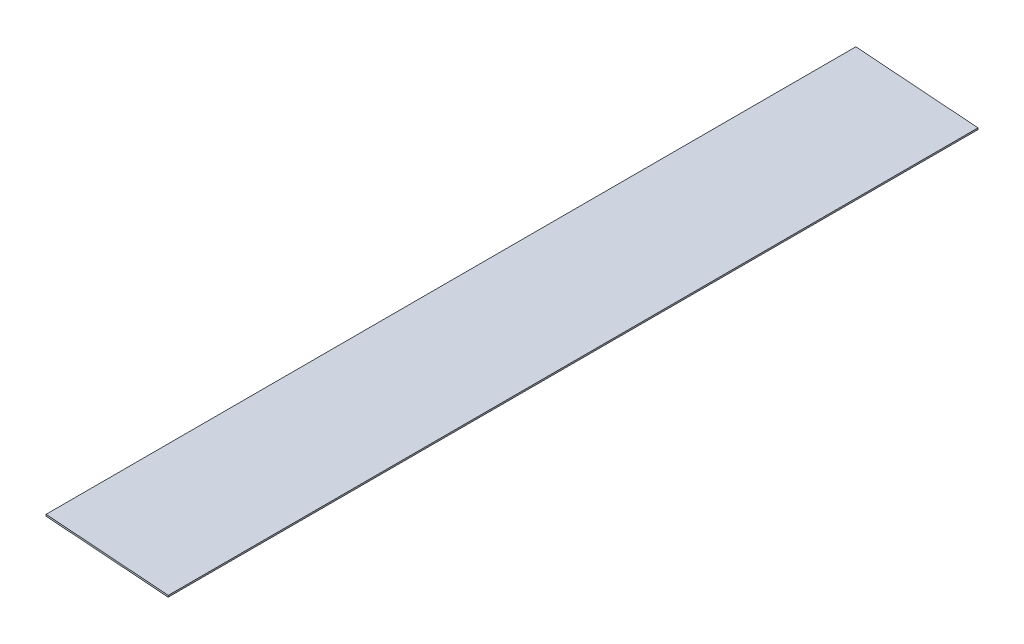
ISO-10303-21;
HEADER;
FILE_DESCRIPTION(('STEP AP214'),'2;1');
FILE_NAME('part.step','',(''),(''),'','','');
FILE_SCHEMA(('AUTOMOTIVE_DESIGN { 1 0 10303 214 1 1 1 1 }'));
ENDSEC;
DATA;
#1=APPLICATION_CONTEXT('core data for automotive mechanical design processes');
#2=APPLICATION_PROTOCOL_DEFINITION('international standard','automotive_design',2000,#1);
#3=PRODUCT_CONTEXT('',#1,'mechanical');
#4=PRODUCT('Part','Part','',(#3));
#5=PRODUCT_RELATED_PRODUCT_CATEGORY('part','',(#4));
#6=PRODUCT_DEFINITION_FORMATION('','',#4);
#7=PRODUCT_DEFINITION_CONTEXT('part definition',#1,'design');
#8=PRODUCT_DEFINITION('design','',#6,#7);
#9=PRODUCT_DEFINITION_SHAPE('','',#8);
#10=(LENGTH_UNIT() NAMED_UNIT(*) SI_UNIT(.MILLI.,.METRE.));
#11=(NAMED_UNIT(*) PLANE_ANGLE_UNIT() SI_UNIT($,.RADIAN.));
#12=(NAMED_UNIT(*) SI_UNIT($,.STERADIAN.) SOLID_ANGLE_UNIT());
#13=UNCERTAINTY_MEASURE_WITH_UNIT(LENGTH_MEASURE(1.E-05),#10,'distance_accuracy_value','');
#14=(GEOMETRIC_REPRESENTATION_CONTEXT(3) GLOBAL_UNCERTAINTY_ASSIGNED_CONTEXT((#13)) GLOBAL_UNIT_ASSIGNED_CONTEXT((#10,
#11,#12)) REPRESENTATION_CONTEXT('',''));
#15=CARTESIAN_POINT('',(0.,0.,0.));
#16=DIRECTION('',(0.,0.,1.));
#17=DIRECTION('',(1.,0.,0.));
#18=AXIS2_PLACEMENT_3D('',#15,#16,#17);
#19=CARTESIAN_POINT('',(-366.091882124065,-2.59705065904796,0.));
#20=DIRECTION('',(0.,0.,-1.));
#21=DIRECTION('',(-1.,0.,0.));
#22=AXIS2_PLACEMENT_3D('',#19,#20,#21);
#23=PLANE('',#22);
#24=CARTESIAN_POINT('',(-394.480856129213,-0.432132552611794,0.));
#25=CARTESIAN_POINT('',(-393.304411991829,-0.526414354543713,0.));
#26=CARTESIAN_POINT('',(-392.132616448483,-0.618641995903297,0.));
#27=CARTESIAN_POINT('',(-389.770621953477,-0.802160875998841,0.));
#28=CARTESIAN_POINT('',(-388.580331816745,-0.893452486845799,0.));
#29=CARTESIAN_POINT('',(-385.019451581036,-1.16673083505754,0.));
#30=CARTESIAN_POINT('',(-382.658705525776,-1.34823978305714,0.));
#31=CARTESIAN_POINT('',(-375.567770856613,-1.88921658464382,0.));
#32=CARTESIAN_POINT('',(-370.828482868122,-2.24501159097367,0.));
#33=CARTESIAN_POINT('',(-361.355281380007,-2.94908972712227,0.));
#34=CARTESIAN_POINT('',(-356.621609667843,-3.29738943971412,0.));
#35=CARTESIAN_POINT('',(-347.15215832284,-3.9878460224912,0.));
#36=CARTESIAN_POINT('',(-342.416260319814,-4.3300056316444,0.));
#37=CARTESIAN_POINT('',(-337.680650157857,-4.66961219245653,0.));
#38=B_SPLINE_CURVE_WITH_KNOTS('',3,(#24,#25,#26,#27,#28,#29,#30,#31,#32,#33,#34,#35,#36,#37),
.UNSPECIFIED.,.F.,.F.,(4,2,2,2,2,2,4),(0.,0.0625000000000005,0.125000000000001,
0.250000000000002,0.500000000000001,0.750000000000001,1.),.UNSPECIFIED.);
#39=CARTESIAN_POINT('',(-394.480856129213,-0.432132552611794,0.));
#40=VERTEX_POINT('',#39);
#41=CARTESIAN_POINT('',(-337.680650157857,-4.66961219245653,0.));
#42=VERTEX_POINT('',#41);
#43=EDGE_CURVE('E84',#40,#42,#38,.T.);
#44=ORIENTED_EDGE('',*,*,#43,.T.);
#45=DIRECTION('',(-0.0715296735955531,-0.997438472185284,0.));
#46=VECTOR('',#45,1.);
#47=CARTESIAN_POINT('',(-337.62387347944,-3.87789540515946,0.));
#48=LINE('',#47,#46);
#49=CARTESIAN_POINT('',(-337.62387347944,-3.87789540515946,0.));
#50=VERTEX_POINT('',#49);
#51=EDGE_CURVE('E89',#50,#42,#48,.T.);
#52=ORIENTED_EDGE('',*,*,#51,.F.);
#53=CARTESIAN_POINT('',(-394.417447245861,0.359080677821093,-1.11022302462516E-13));
#54=CARTESIAN_POINT('',(-393.230661768428,0.263970107107646,-1.11022302462516E-13));
#55=CARTESIAN_POINT('',(-390.866358070208,0.0779164668924348,-1.11022302462516E-13));
#56=CARTESIAN_POINT('',(-386.060675303901,-0.290578122087498,-1.11022302462516E-13));
#57=CARTESIAN_POINT('',(-377.721282307263,-0.931740930199472,-1.11022302462516E-13));
#58=CARTESIAN_POINT('',(-365.762095921006,-1.82919803292392,-1.11022302462516E-13));
#59=CARTESIAN_POINT('',(-351.651678250431,-2.86695932947077,-1.11022302462516E-13));
#60=CARTESIAN_POINT('',(-342.26984825137,-3.54469230895433,-1.11022302462516E-13));
#61=CARTESIAN_POINT('',(-337.668542394644,-3.87469204674337,-1.11022302462516E-13));
#62=CARTESIAN_POINT('',(-337.62387347944,-3.87789540515946,-1.11022302462516E-13));
#63=B_SPLINE_CURVE_WITH_KNOTS('',3,(#53,#54,#55,#56,#57,#58,#59,#60,#61,#62),.UNSPECIFIED.,.F.,
.F.,(4,1,1,1,1,1,1,4),(0.923463793337329,0.927865862088169,0.93226793083901,0.94107206834069,
0.958680343344051,0.976288618347413,0.993074146933221,0.993238696216732),.UNSPECIFIED.);
#64=CARTESIAN_POINT('',(-394.417447245861,0.359080677821093,0.));
#65=VERTEX_POINT('',#64);
#66=EDGE_CURVE('E96',#65,#50,#63,.T.);
#67=ORIENTED_EDGE('',*,*,#66,.F.);
#68=DIRECTION('',(0.0798852073726555,0.99680406983671,0.));
#69=VECTOR('',#68,1.);
#70=CARTESIAN_POINT('',(-394.480856129213,-0.432132552611794,0.));
#71=LINE('',#70,#69);
#72=EDGE_CURVE('E87',#40,#65,#71,.T.);
#73=ORIENTED_EDGE('',*,*,#72,.F.);
#74=EDGE_LOOP('',(#44,#52,#67,#73));
#75=FACE_BOUND('',#74,.T.);
#76=ADVANCED_FACE('F39',(#75),#23,.F.);
#77=CARTESIAN_POINT('',(-337.62387347944,-3.87789540515946,-433.567211057944));
#78=DIRECTION('',(-0.997438472185284,0.0715296735955531,0.));
#79=DIRECTION('',(-0.0715296735955531,-0.997438472185284,0.));
#80=AXIS2_PLACEMENT_3D('',#77,#78,#79);
#81=PLANE('',#80);
#82=DIRECTION('',(0.,0.,1.));
#83=VECTOR('',#82,1.);
#84=CARTESIAN_POINT('',(-337.680650157857,-4.66961219245653,-433.567211057944));
#85=LINE('',#84,#83);
#86=CARTESIAN_POINT('',(-337.680650157857,-4.66961219245653,-376.48828125));
#87=VERTEX_POINT('',#86);
#88=EDGE_CURVE('E77',#87,#42,#85,.T.);
#89=ORIENTED_EDGE('',*,*,#88,.F.);
#90=DIRECTION('',(0.0715296735955531,0.997438472185284,0.));
#91=VECTOR('',#90,1.);
#92=CARTESIAN_POINT('',(-337.62387347944,-3.87789540515946,-376.48828125));
#93=LINE('',#92,#91);
#94=CARTESIAN_POINT('',(-337.62387347944,-3.87789540515946,-376.48828125));
#95=VERTEX_POINT('',#94);
#96=EDGE_CURVE('E115',#87,#95,#93,.T.);
#97=ORIENTED_EDGE('',*,*,#96,.T.);
#98=DIRECTION('',(0.,0.,1.));
#99=VECTOR('',#98,1.);
#100=CARTESIAN_POINT('',(-337.62387347944,-3.87789540515946,-433.567211057944));
#101=LINE('',#100,#99);
#102=EDGE_CURVE('E88',#95,#50,#101,.T.);
#103=ORIENTED_EDGE('',*,*,#102,.T.);
#104=ORIENTED_EDGE('',*,*,#51,.T.);
#105=EDGE_LOOP('',(#89,#97,#103,#104));
#106=FACE_BOUND('',#105,.T.);
#107=ADVANCED_FACE('F93',(#106),#81,.F.);
#108=CARTESIAN_POINT('',(-394.417447245861,0.359080677821093,-433.567211057944));
#109=CARTESIAN_POINT('',(-393.230661768428,0.263970107107646,-433.567211057944));
#110=CARTESIAN_POINT('',(-390.866358070208,0.0779164668924348,-433.567211057944));
#111=CARTESIAN_POINT('',(-386.060675303901,-0.290578122087498,-433.567211057944));
#112=CARTESIAN_POINT('',(-377.721282307263,-0.931740930199472,-433.567211057944));
#113=CARTESIAN_POINT('',(-365.762095921006,-1.82919803292392,-433.567211057944));
#114=CARTESIAN_POINT('',(-351.651678250431,-2.86695932947077,-433.567211057944));
#115=CARTESIAN_POINT('',(-342.26984825137,-3.54469230895433,-433.567211057944));
#116=CARTESIAN_POINT('',(-337.668542394644,-3.87469204674337,-433.567211057944));
#117=CARTESIAN_POINT('',(-337.62387347944,-3.87789540515946,-433.567211057944));
#118=B_SPLINE_CURVE_WITH_KNOTS('',3,(#108,#109,#110,#111,#112,#113,#114,#115,#116,#117),
.UNSPECIFIED.,.F.,.F.,(4,1,1,1,1,1,1,4),(0.923463793337329,0.927865862088169,0.93226793083901,
0.94107206834069,0.958680343344051,0.976288618347413,0.993074146933221,0.993238696216732),.UNSPECIFIED.);
#119=DIRECTION('',(0.,0.,1.));
#120=VECTOR('',#119,1.);
#121=SURFACE_OF_LINEAR_EXTRUSION('',#118,#120);
#122=ORIENTED_EDGE('',*,*,#102,.F.);
#123=CARTESIAN_POINT('',(-394.417447245861,0.359080677821093,-376.48828125));
#124=CARTESIAN_POINT('',(-393.230661768428,0.263970107107646,-376.48828125));
#125=CARTESIAN_POINT('',(-390.866358070208,0.0779164668924348,-376.48828125));
#126=CARTESIAN_POINT('',(-386.060675303901,-0.290578122087498,-376.48828125));
#127=CARTESIAN_POINT('',(-377.721282307263,-0.931740930199472,-376.48828125));
#128=CARTESIAN_POINT('',(-365.762095921006,-1.82919803292392,-376.48828125));
#129=CARTESIAN_POINT('',(-351.651678250431,-2.86695932947077,-376.48828125));
#130=CARTESIAN_POINT('',(-342.26984825137,-3.54469230895433,-376.48828125));
#131=CARTESIAN_POINT('',(-337.668542394644,-3.87469204674337,-376.48828125));
#132=CARTESIAN_POINT('',(-337.62387347944,-3.87789540515946,-376.48828125));
#133=B_SPLINE_CURVE_WITH_KNOTS('',3,(#123,#124,#125,#126,#127,#128,#129,#130,#131,#132),
.UNSPECIFIED.,.F.,.F.,(4,1,1,1,1,1,1,4),(0.923463793337329,0.927865862088169,0.93226793083901,
0.94107206834069,0.958680343344051,0.976288618347413,0.993074146933221,0.993238696216732),.UNSPECIFIED.);
#134=CARTESIAN_POINT('',(-394.417447245861,0.359080677821093,-376.48828125));
#135=VERTEX_POINT('',#134);
#136=EDGE_CURVE('E122',#95,#135,#133,.F.);
#137=ORIENTED_EDGE('',*,*,#136,.T.);
#138=DIRECTION('',(0.,0.,1.));
#139=VECTOR('',#138,1.);
#140=CARTESIAN_POINT('',(-394.417447245861,0.359080677821093,-433.567211057944));
#141=LINE('',#140,#139);
#142=EDGE_CURVE('E42',#135,#65,#141,.T.);
#143=ORIENTED_EDGE('',*,*,#142,.T.);
#144=ORIENTED_EDGE('',*,*,#66,.T.);
#145=EDGE_LOOP('',(#122,#137,#143,#144));
#146=FACE_BOUND('',#145,.T.);
#147=ADVANCED_FACE('F145',(#146),#121,.F.);
#148=CARTESIAN_POINT('',(-394.480856129213,-0.432132552611794,-433.567211057944));
#149=DIRECTION('',(0.99680406983671,-0.0798852073726555,0.));
#150=DIRECTION('',(0.0798852073726555,0.99680406983671,0.));
#151=AXIS2_PLACEMENT_3D('',#148,#149,#150);
#152=PLANE('',#151);
#153=ORIENTED_EDGE('',*,*,#142,.F.);
#154=DIRECTION('',(-0.0798852073726555,-0.99680406983671,0.));
#155=VECTOR('',#154,1.);
#156=CARTESIAN_POINT('',(-394.480856129213,-0.432132552611794,-376.48828125));
#157=LINE('',#156,#155);
#158=CARTESIAN_POINT('',(-394.480856129213,-0.432132552611794,-376.48828125));
#159=VERTEX_POINT('',#158);
#160=EDGE_CURVE('E49',#135,#159,#157,.T.);
#161=ORIENTED_EDGE('',*,*,#160,.T.);
#162=DIRECTION('',(0.,0.,1.));
#163=VECTOR('',#162,1.);
#164=CARTESIAN_POINT('',(-394.480856129213,-0.432132552611794,-433.567211057944));
#165=LINE('',#164,#163);
#166=EDGE_CURVE('E107',#159,#40,#165,.T.);
#167=ORIENTED_EDGE('',*,*,#166,.T.);
#168=ORIENTED_EDGE('',*,*,#72,.T.);
#169=EDGE_LOOP('',(#153,#161,#167,#168));
#170=FACE_BOUND('',#169,.T.);
#171=ADVANCED_FACE('F141',(#170),#152,.F.);
#172=CARTESIAN_POINT('',(-394.480856129213,-0.432132552611794,-433.567211057944));
#173=CARTESIAN_POINT('',(-393.304411991829,-0.526414354543713,-433.567211057944));
#174=CARTESIAN_POINT('',(-392.132616448483,-0.618641995903297,-433.567211057944));
#175=CARTESIAN_POINT('',(-389.770621953477,-0.802160875998841,-433.567211057944));
#176=CARTESIAN_POINT('',(-388.580331816745,-0.893452486845799,-433.567211057944));
#177=CARTESIAN_POINT('',(-385.019451581036,-1.16673083505754,-433.567211057944));
#178=CARTESIAN_POINT('',(-382.658705525776,-1.34823978305714,-433.567211057944));
#179=CARTESIAN_POINT('',(-375.567770856613,-1.88921658464382,-433.567211057944));
#180=CARTESIAN_POINT('',(-370.828482868122,-2.24501159097367,-433.567211057944));
#181=CARTESIAN_POINT('',(-361.355281380007,-2.94908972712227,-433.567211057944));
#182=CARTESIAN_POINT('',(-356.621609667843,-3.29738943971412,-433.567211057944));
#183=CARTESIAN_POINT('',(-347.15215832284,-3.9878460224912,-433.567211057944));
#184=CARTESIAN_POINT('',(-342.416260319814,-4.3300056316444,-433.567211057944));
#185=CARTESIAN_POINT('',(-337.680650157857,-4.66961219245653,-433.567211057944));
#186=B_SPLINE_CURVE_WITH_KNOTS('',3,(#172,#173,#174,#175,#176,#177,#178,#179,#180,#181,#182,
#183,#184,#185),.UNSPECIFIED.,.F.,.F.,(4,2,2,2,2,2,4),(0.,0.0625000000000005,0.125000000000001,
0.250000000000002,0.500000000000001,0.750000000000001,1.),.UNSPECIFIED.);
#187=DIRECTION('',(0.,0.,1.));
#188=VECTOR('',#187,1.);
#189=SURFACE_OF_LINEAR_EXTRUSION('',#186,#188);
#190=CARTESIAN_POINT('',(-394.480856129213,-0.432132552611794,-376.48828125));
#191=CARTESIAN_POINT('',(-393.304411991829,-0.526414354543713,-376.48828125));
#192=CARTESIAN_POINT('',(-392.132616448483,-0.618641995903297,-376.48828125));
#193=CARTESIAN_POINT('',(-389.770621953477,-0.802160875998841,-376.48828125));
#194=CARTESIAN_POINT('',(-388.580331816745,-0.893452486845799,-376.48828125));
#195=CARTESIAN_POINT('',(-385.019451581036,-1.16673083505754,-376.48828125));
#196=CARTESIAN_POINT('',(-382.658705525776,-1.34823978305714,-376.48828125));
#197=CARTESIAN_POINT('',(-375.567770856613,-1.88921658464382,-376.48828125));
#198=CARTESIAN_POINT('',(-370.828482868122,-2.24501159097367,-376.48828125));
#199=CARTESIAN_POINT('',(-361.355281380007,-2.94908972712227,-376.48828125));
#200=CARTESIAN_POINT('',(-356.621609667843,-3.29738943971412,-376.48828125));
#201=CARTESIAN_POINT('',(-347.15215832284,-3.9878460224912,-376.48828125));
#202=CARTESIAN_POINT('',(-342.416260319814,-4.3300056316444,-376.48828125));
#203=CARTESIAN_POINT('',(-337.680650157857,-4.66961219245653,-376.48828125));
#204=B_SPLINE_CURVE_WITH_KNOTS('',3,(#190,#191,#192,#193,#194,#195,#196,#197,#198,#199,#200,
#201,#202,#203),.UNSPECIFIED.,.F.,.F.,(4,2,2,2,2,2,4),(0.,0.0625000000000005,0.125000000000001,
0.250000000000002,0.500000000000001,0.750000000000001,1.),.UNSPECIFIED.);
#205=EDGE_CURVE('E11',#87,#159,#204,.F.);
#206=ORIENTED_EDGE('',*,*,#205,.F.);
#207=ORIENTED_EDGE('',*,*,#88,.T.);
#208=ORIENTED_EDGE('',*,*,#43,.F.);
#209=ORIENTED_EDGE('',*,*,#166,.F.);
#210=EDGE_LOOP('',(#206,#207,#208,#209));
#211=FACE_BOUND('',#210,.T.);
#212=ADVANCED_FACE('F41',(#211),#189,.T.);
#213=CARTESIAN_POINT('',(-0.400092727756273,2.26292544800455,-376.48828125));
#214=DIRECTION('',(0.,0.,1.));
#215=DIRECTION('',(1.,0.,0.));
#216=AXIS2_PLACEMENT_3D('',#213,#214,#215);
#217=PLANE('',#216);
#218=ORIENTED_EDGE('',*,*,#205,.T.);
#219=ORIENTED_EDGE('',*,*,#160,.F.);
#220=ORIENTED_EDGE('',*,*,#136,.F.);
#221=ORIENTED_EDGE('',*,*,#96,.F.);
#222=EDGE_LOOP('',(#218,#219,#220,#221));
#223=FACE_BOUND('',#222,.T.);
#224=ADVANCED_FACE('F165',(#223),#217,.F.);
#225=CLOSED_SHELL('',(#76,#107,#147,#171,#212,#224));
#226=MANIFOLD_SOLID_BREP('B2',#225);
#227=ADVANCED_BREP_SHAPE_REPRESENTATION('',(#18,#226),#14);
#228=SHAPE_DEFINITION_REPRESENTATION(#9,#227);
ENDSEC;
END-ISO-10303-21;
